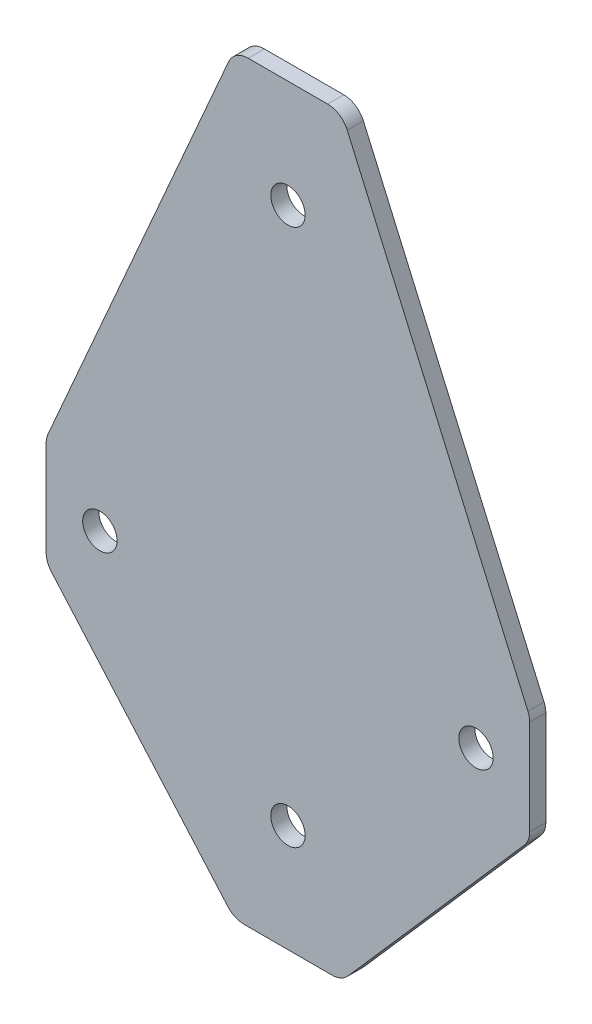
ISO-10303-21;
HEADER;
FILE_DESCRIPTION(('STEP AP214'),'2;1');
FILE_NAME('part.step','',(''),(''),'','','');
FILE_SCHEMA(('AUTOMOTIVE_DESIGN { 1 0 10303 214 1 1 1 1 }'));
ENDSEC;
DATA;
#1=APPLICATION_CONTEXT('core data for automotive mechanical design processes');
#2=APPLICATION_PROTOCOL_DEFINITION('international standard','automotive_design',2000,#1);
#3=PRODUCT_CONTEXT('',#1,'mechanical');
#4=PRODUCT('Part','Part','',(#3));
#5=PRODUCT_RELATED_PRODUCT_CATEGORY('part','',(#4));
#6=PRODUCT_DEFINITION_FORMATION('','',#4);
#7=PRODUCT_DEFINITION_CONTEXT('part definition',#1,'design');
#8=PRODUCT_DEFINITION('design','',#6,#7);
#9=PRODUCT_DEFINITION_SHAPE('','',#8);
#10=(LENGTH_UNIT() NAMED_UNIT(*) SI_UNIT(.MILLI.,.METRE.));
#11=(NAMED_UNIT(*) PLANE_ANGLE_UNIT() SI_UNIT($,.RADIAN.));
#12=(NAMED_UNIT(*) SI_UNIT($,.STERADIAN.) SOLID_ANGLE_UNIT());
#13=UNCERTAINTY_MEASURE_WITH_UNIT(LENGTH_MEASURE(1.E-05),#10,'distance_accuracy_value','');
#14=(GEOMETRIC_REPRESENTATION_CONTEXT(3) GLOBAL_UNCERTAINTY_ASSIGNED_CONTEXT((#13)) GLOBAL_UNIT_ASSIGNED_CONTEXT((#10,
#11,#12)) REPRESENTATION_CONTEXT('',''));
#15=CARTESIAN_POINT('',(0.,0.,0.));
#16=DIRECTION('',(0.,0.,1.));
#17=DIRECTION('',(1.,0.,0.));
#18=AXIS2_PLACEMENT_3D('',#15,#16,#17);
#19=CARTESIAN_POINT('',(26.2295081967213,11.4754098360656,1.5));
#20=DIRECTION('',(0.916157334902189,0.400818834019708,0.));
#21=DIRECTION('',(-0.400818834019708,0.916157334902189,0.));
#22=AXIS2_PLACEMENT_3D('',#19,#20,#21);
#23=PLANE('',#22);
#24=DIRECTION('',(0.400818834019708,-0.916157334902189,0.));
#25=VECTOR('',#24,1.);
#26=CARTESIAN_POINT('',(26.2295081967213,11.4754098360656,1.5));
#27=LINE('',#26,#25);
#28=CARTESIAN_POINT('',(5.52428352023275,58.8016376680394,1.5));
#29=VERTEX_POINT('',#28);
#30=CARTESIAN_POINT('',(22.3323146698044,20.3832807547329,1.5));
#31=VERTEX_POINT('',#30);
#32=EDGE_CURVE('E210',#29,#31,#27,.T.);
#33=ORIENTED_EDGE('',*,*,#32,.T.);
#34=DIRECTION('',(0.,0.,-1.));
#35=VECTOR('',#34,1.);
#36=CARTESIAN_POINT('',(22.3323146698044,20.3832807547329,1.5));
#37=LINE('',#36,#35);
#38=CARTESIAN_POINT('',(22.3323146698044,20.3832807547329,0.));
#39=VERTEX_POINT('',#38);
#40=EDGE_CURVE('E286',#31,#39,#37,.T.);
#41=ORIENTED_EDGE('',*,*,#40,.T.);
#42=DIRECTION('',(0.400818834019708,-0.916157334902189,0.));
#43=VECTOR('',#42,1.);
#44=CARTESIAN_POINT('',(26.2295081967213,11.4754098360656,0.));
#45=LINE('',#44,#43);
#46=CARTESIAN_POINT('',(5.52428352023275,58.8016376680394,0.));
#47=VERTEX_POINT('',#46);
#48=EDGE_CURVE('E300',#47,#39,#45,.T.);
#49=ORIENTED_EDGE('',*,*,#48,.F.);
#50=DIRECTION('',(0.,0.,-1.));
#51=VECTOR('',#50,1.);
#52=CARTESIAN_POINT('',(5.52428352023275,58.8016376680394,1.5));
#53=LINE('',#52,#51);
#54=EDGE_CURVE('E284',#47,#29,#53,.F.);
#55=ORIENTED_EDGE('',*,*,#54,.T.);
#56=EDGE_LOOP('',(#33,#41,#49,#55));
#57=FACE_BOUND('',#56,.T.);
#58=ADVANCED_FACE('F39',(#57),#23,.T.);
#59=CARTESIAN_POINT('',(0.,60.,1.5));
#60=DIRECTION('',(0.,1.,0.));
#61=DIRECTION('',(0.,0.,1.));
#62=AXIS2_PLACEMENT_3D('',#59,#60,#61);
#63=PLANE('',#62);
#64=DIRECTION('',(1.,0.,0.));
#65=VECTOR('',#64,1.);
#66=CARTESIAN_POINT('',(0.,60.,0.));
#67=LINE('',#66,#65);
#68=CARTESIAN_POINT('',(-3.69196885042837,60.,0.));
#69=VERTEX_POINT('',#68);
#70=CARTESIAN_POINT('',(3.69196885042837,60.,0.));
#71=VERTEX_POINT('',#70);
#72=EDGE_CURVE('E186',#69,#71,#67,.T.);
#73=ORIENTED_EDGE('',*,*,#72,.F.);
#74=DIRECTION('',(0.,0.,-1.));
#75=VECTOR('',#74,1.);
#76=CARTESIAN_POINT('',(-3.69196885042837,60.,1.5));
#77=LINE('',#76,#75);
#78=CARTESIAN_POINT('',(-3.69196885042837,60.,1.5));
#79=VERTEX_POINT('',#78);
#80=EDGE_CURVE('E12',#69,#79,#77,.F.);
#81=ORIENTED_EDGE('',*,*,#80,.T.);
#82=DIRECTION('',(1.,0.,0.));
#83=VECTOR('',#82,1.);
#84=CARTESIAN_POINT('',(0.,60.,1.5));
#85=LINE('',#84,#83);
#86=CARTESIAN_POINT('',(3.69196885042837,60.,1.5));
#87=VERTEX_POINT('',#86);
#88=EDGE_CURVE('E242',#79,#87,#85,.T.);
#89=ORIENTED_EDGE('',*,*,#88,.T.);
#90=DIRECTION('',(0.,0.,-1.));
#91=VECTOR('',#90,1.);
#92=CARTESIAN_POINT('',(3.69196885042837,60.,1.5));
#93=LINE('',#92,#91);
#94=EDGE_CURVE('E47',#87,#71,#93,.T.);
#95=ORIENTED_EDGE('',*,*,#94,.T.);
#96=EDGE_LOOP('',(#73,#81,#89,#95));
#97=FACE_BOUND('',#96,.T.);
#98=ADVANCED_FACE('F293',(#97),#63,.T.);
#99=CARTESIAN_POINT('',(-26.2295081967213,11.4754098360656,1.5));
#100=DIRECTION('',(0.916157334902189,-0.400818834019708,0.));
#101=DIRECTION('',(0.400818834019708,0.916157334902189,0.));
#102=AXIS2_PLACEMENT_3D('',#99,#100,#101);
#103=PLANE('',#102);
#104=DIRECTION('',(-0.400818834019708,-0.916157334902189,0.));
#105=VECTOR('',#104,1.);
#106=CARTESIAN_POINT('',(-26.2295081967213,11.4754098360656,0.));
#107=LINE('',#106,#105);
#108=CARTESIAN_POINT('',(-5.52428352023275,58.8016376680394,0.));
#109=VERTEX_POINT('',#108);
#110=CARTESIAN_POINT('',(-22.3323146698044,20.3832807547328,0.));
#111=VERTEX_POINT('',#110);
#112=EDGE_CURVE('E181',#109,#111,#107,.T.);
#113=ORIENTED_EDGE('',*,*,#112,.T.);
#114=DIRECTION('',(0.,0.,-1.));
#115=VECTOR('',#114,1.);
#116=CARTESIAN_POINT('',(-22.3323146698044,20.3832807547328,1.5));
#117=LINE('',#116,#115);
#118=CARTESIAN_POINT('',(-22.3323146698044,20.3832807547328,1.5));
#119=VERTEX_POINT('',#118);
#120=EDGE_CURVE('E158',#111,#119,#117,.F.);
#121=ORIENTED_EDGE('',*,*,#120,.T.);
#122=DIRECTION('',(-0.400818834019708,-0.916157334902189,0.));
#123=VECTOR('',#122,1.);
#124=CARTESIAN_POINT('',(-26.2295081967213,11.4754098360656,1.5));
#125=LINE('',#124,#123);
#126=CARTESIAN_POINT('',(-5.52428352023275,58.8016376680394,1.5));
#127=VERTEX_POINT('',#126);
#128=EDGE_CURVE('E246',#127,#119,#125,.T.);
#129=ORIENTED_EDGE('',*,*,#128,.F.);
#130=DIRECTION('',(0.,0.,-1.));
#131=VECTOR('',#130,1.);
#132=CARTESIAN_POINT('',(-5.52428352023275,58.8016376680394,0.));
#133=LINE('',#132,#131);
#134=EDGE_CURVE('E163',#127,#109,#133,.T.);
#135=ORIENTED_EDGE('',*,*,#134,.T.);
#136=EDGE_LOOP('',(#113,#121,#129,#135));
#137=FACE_BOUND('',#136,.T.);
#138=ADVANCED_FACE('F372',(#137),#103,.F.);
#139=CARTESIAN_POINT('',(-22.5,0.,1.5));
#140=DIRECTION('',(1.,0.,0.));
#141=DIRECTION('',(0.,0.,-1.));
#142=AXIS2_PLACEMENT_3D('',#139,#140,#141);
#143=PLANE('',#142);
#144=DIRECTION('',(0.,-1.,0.));
#145=VECTOR('',#144,1.);
#146=CARTESIAN_POINT('',(-22.5,0.,1.5));
#147=LINE('',#146,#145);
#148=CARTESIAN_POINT('',(-22.5,19.5816430866934,1.5));
#149=VERTEX_POINT('',#148);
#150=CARTESIAN_POINT('',(-22.5,10.7514702322099,1.5));
#151=VERTEX_POINT('',#150);
#152=EDGE_CURVE('E173',#149,#151,#147,.T.);
#153=ORIENTED_EDGE('',*,*,#152,.F.);
#154=DIRECTION('',(0.,0.,-1.));
#155=VECTOR('',#154,1.);
#156=CARTESIAN_POINT('',(-22.5,19.5816430866934,1.5));
#157=LINE('',#156,#155);
#158=CARTESIAN_POINT('',(-22.5,19.5816430866934,0.));
#159=VERTEX_POINT('',#158);
#160=EDGE_CURVE('E157',#149,#159,#157,.T.);
#161=ORIENTED_EDGE('',*,*,#160,.T.);
#162=DIRECTION('',(0.,-1.,0.));
#163=VECTOR('',#162,1.);
#164=CARTESIAN_POINT('',(-22.5,0.,0.));
#165=LINE('',#164,#163);
#166=CARTESIAN_POINT('',(-22.5,10.7514702322099,0.));
#167=VERTEX_POINT('',#166);
#168=EDGE_CURVE('E170',#159,#167,#165,.T.);
#169=ORIENTED_EDGE('',*,*,#168,.T.);
#170=DIRECTION('',(0.,0.,-1.));
#171=VECTOR('',#170,1.);
#172=CARTESIAN_POINT('',(-22.5,10.7514702322099,1.5));
#173=LINE('',#172,#171);
#174=EDGE_CURVE('E175',#167,#151,#173,.F.);
#175=ORIENTED_EDGE('',*,*,#174,.T.);
#176=EDGE_LOOP('',(#153,#161,#169,#175));
#177=FACE_BOUND('',#176,.T.);
#178=ADVANCED_FACE('F169',(#177),#143,.F.);
#179=CARTESIAN_POINT('',(-7.78761061946905,-6.8141592920354,1.5));
#180=DIRECTION('',(0.752576694706878,0.658504607868517,0.));
#181=DIRECTION('',(-0.658504607868517,0.752576694706879,0.));
#182=AXIS2_PLACEMENT_3D('',#179,#180,#181);
#183=PLANE('',#182);
#184=DIRECTION('',(0.658504607868517,-0.752576694706878,0.));
#185=VECTOR('',#184,1.);
#186=CARTESIAN_POINT('',(-7.78761061946905,-6.8141592920354,1.5));
#187=LINE('',#186,#185);
#188=CARTESIAN_POINT('',(-22.0051533894138,9.43446101647287,1.5));
#189=VERTEX_POINT('',#188);
#190=CARTESIAN_POINT('',(-5.59761693623009,-9.31700921573707,1.5));
#191=VERTEX_POINT('',#190);
#192=EDGE_CURVE('E341',#189,#191,#187,.T.);
#193=ORIENTED_EDGE('',*,*,#192,.F.);
#194=DIRECTION('',(0.,0.,-1.));
#195=VECTOR('',#194,1.);
#196=CARTESIAN_POINT('',(-22.0051533894138,9.43446101647287,1.5));
#197=LINE('',#196,#195);
#198=CARTESIAN_POINT('',(-22.0051533894138,9.43446101647287,0.));
#199=VERTEX_POINT('',#198);
#200=EDGE_CURVE('E267',#189,#199,#197,.T.);
#201=ORIENTED_EDGE('',*,*,#200,.T.);
#202=DIRECTION('',(0.658504607868517,-0.752576694706878,0.));
#203=VECTOR('',#202,1.);
#204=CARTESIAN_POINT('',(-7.78761061946905,-6.8141592920354,0.));
#205=LINE('',#204,#203);
#206=CARTESIAN_POINT('',(-5.59761693623009,-9.31700921573707,0.));
#207=VERTEX_POINT('',#206);
#208=EDGE_CURVE('E180',#199,#207,#205,.T.);
#209=ORIENTED_EDGE('',*,*,#208,.T.);
#210=DIRECTION('',(0.,0.,-1.));
#211=VECTOR('',#210,1.);
#212=CARTESIAN_POINT('',(-5.59761693623009,-9.31700921573707,1.5));
#213=LINE('',#212,#211);
#214=EDGE_CURVE('E262',#207,#191,#213,.F.);
#215=ORIENTED_EDGE('',*,*,#214,.T.);
#216=EDGE_LOOP('',(#193,#201,#209,#215));
#217=FACE_BOUND('',#216,.T.);
#218=ADVANCED_FACE('F363',(#217),#183,.F.);
#219=CARTESIAN_POINT('',(0.,-10.,1.5));
#220=DIRECTION('',(0.,1.,0.));
#221=DIRECTION('',(-1.,0.,0.));
#222=AXIS2_PLACEMENT_3D('',#219,#220,#221);
#223=PLANE('',#222);
#224=DIRECTION('',(1.,0.,0.));
#225=VECTOR('',#224,1.);
#226=CARTESIAN_POINT('',(0.,-10.,1.5));
#227=LINE('',#226,#225);
#228=CARTESIAN_POINT('',(-4.09246354681634,-10.,1.5));
#229=VERTEX_POINT('',#228);
#230=CARTESIAN_POINT('',(4.09246354681633,-10.,1.5));
#231=VERTEX_POINT('',#230);
#232=EDGE_CURVE('E338',#229,#231,#227,.T.);
#233=ORIENTED_EDGE('',*,*,#232,.F.);
#234=DIRECTION('',(0.,0.,-1.));
#235=VECTOR('',#234,1.);
#236=CARTESIAN_POINT('',(-4.09246354681634,-10.,1.5));
#237=LINE('',#236,#235);
#238=CARTESIAN_POINT('',(-4.09246354681634,-10.,0.));
#239=VERTEX_POINT('',#238);
#240=EDGE_CURVE('E272',#229,#239,#237,.T.);
#241=ORIENTED_EDGE('',*,*,#240,.T.);
#242=DIRECTION('',(1.,0.,0.));
#243=VECTOR('',#242,1.);
#244=CARTESIAN_POINT('',(0.,-10.,0.));
#245=LINE('',#244,#243);
#246=CARTESIAN_POINT('',(4.09246354681633,-10.,0.));
#247=VERTEX_POINT('',#246);
#248=EDGE_CURVE('E184',#239,#247,#245,.T.);
#249=ORIENTED_EDGE('',*,*,#248,.T.);
#250=DIRECTION('',(0.,0.,-1.));
#251=VECTOR('',#250,1.);
#252=CARTESIAN_POINT('',(4.09246354681633,-10.,1.5));
#253=LINE('',#252,#251);
#254=EDGE_CURVE('E270',#247,#231,#253,.F.);
#255=ORIENTED_EDGE('',*,*,#254,.T.);
#256=EDGE_LOOP('',(#233,#241,#249,#255));
#257=FACE_BOUND('',#256,.T.);
#258=ADVANCED_FACE('F358',(#257),#223,.F.);
#259=CARTESIAN_POINT('',(7.78761061946905,-6.8141592920354,1.5));
#260=DIRECTION('',(0.752576694706878,-0.658504607868517,0.));
#261=DIRECTION('',(0.658504607868517,0.752576694706878,0.));
#262=AXIS2_PLACEMENT_3D('',#259,#260,#261);
#263=PLANE('',#262);
#264=DIRECTION('',(-0.658504607868518,-0.752576694706878,0.));
#265=VECTOR('',#264,1.);
#266=CARTESIAN_POINT('',(7.78761061946905,-6.8141592920354,1.5));
#267=LINE('',#266,#265);
#268=CARTESIAN_POINT('',(22.0051533894138,9.43446101647286,1.5));
#269=VERTEX_POINT('',#268);
#270=CARTESIAN_POINT('',(5.59761693623009,-9.31700921573707,1.5));
#271=VERTEX_POINT('',#270);
#272=EDGE_CURVE('E319',#269,#271,#267,.T.);
#273=ORIENTED_EDGE('',*,*,#272,.T.);
#274=DIRECTION('',(0.,0.,-1.));
#275=VECTOR('',#274,1.);
#276=CARTESIAN_POINT('',(5.59761693623009,-9.31700921573707,0.));
#277=LINE('',#276,#275);
#278=CARTESIAN_POINT('',(5.59761693623009,-9.31700921573707,0.));
#279=VERTEX_POINT('',#278);
#280=EDGE_CURVE('E277',#271,#279,#277,.T.);
#281=ORIENTED_EDGE('',*,*,#280,.T.);
#282=DIRECTION('',(-0.658504607868518,-0.752576694706878,0.));
#283=VECTOR('',#282,1.);
#284=CARTESIAN_POINT('',(7.78761061946905,-6.8141592920354,0.));
#285=LINE('',#284,#283);
#286=CARTESIAN_POINT('',(22.0051533894138,9.43446101647286,0.));
#287=VERTEX_POINT('',#286);
#288=EDGE_CURVE('E192',#287,#279,#285,.T.);
#289=ORIENTED_EDGE('',*,*,#288,.F.);
#290=DIRECTION('',(0.,0.,-1.));
#291=VECTOR('',#290,1.);
#292=CARTESIAN_POINT('',(22.0051533894138,9.43446101647286,1.5));
#293=LINE('',#292,#291);
#294=EDGE_CURVE('E275',#287,#269,#293,.F.);
#295=ORIENTED_EDGE('',*,*,#294,.T.);
#296=EDGE_LOOP('',(#273,#281,#289,#295));
#297=FACE_BOUND('',#296,.T.);
#298=ADVANCED_FACE('F370',(#297),#263,.T.);
#299=CARTESIAN_POINT('',(-17.5,15.,1.5));
#300=DIRECTION('',(0.,0.,-1.));
#301=DIRECTION('',(-1.,0.,0.));
#302=AXIS2_PLACEMENT_3D('',#299,#300,#301);
#303=CYLINDRICAL_SURFACE('',#302,1.6);
#304=CARTESIAN_POINT('',(-17.5,15.,1.5));
#305=DIRECTION('',(0.,0.,1.));
#306=DIRECTION('',(1.,0.,0.));
#307=AXIS2_PLACEMENT_3D('',#304,#305,#306);
#308=CIRCLE('',#307,1.6);
#309=CARTESIAN_POINT('',(-15.9,15.,1.5));
#310=VERTEX_POINT('',#309);
#311=EDGE_CURVE('E304',#310,#310,#308,.T.);
#312=ORIENTED_EDGE('',*,*,#311,.T.);
#313=EDGE_LOOP('',(#312));
#314=FACE_BOUND('',#313,.T.);
#315=CARTESIAN_POINT('',(-17.5,15.,0.));
#316=DIRECTION('',(0.,0.,1.));
#317=DIRECTION('',(1.,0.,0.));
#318=AXIS2_PLACEMENT_3D('',#315,#316,#317);
#319=CIRCLE('',#318,1.6);
#320=CARTESIAN_POINT('',(-15.9,15.,0.));
#321=VERTEX_POINT('',#320);
#322=EDGE_CURVE('E204',#321,#321,#319,.T.);
#323=ORIENTED_EDGE('',*,*,#322,.F.);
#324=EDGE_LOOP('',(#323));
#325=FACE_BOUND('',#324,.T.);
#326=ADVANCED_FACE('F439',(#314,#325),#303,.F.);
#327=CARTESIAN_POINT('',(0.,50.,1.5));
#328=DIRECTION('',(0.,0.,-1.));
#329=DIRECTION('',(-1.,0.,0.));
#330=AXIS2_PLACEMENT_3D('',#327,#328,#329);
#331=CYLINDRICAL_SURFACE('',#330,1.6);
#332=CARTESIAN_POINT('',(0.,50.,1.5));
#333=DIRECTION('',(0.,0.,1.));
#334=DIRECTION('',(1.,0.,0.));
#335=AXIS2_PLACEMENT_3D('',#332,#333,#334);
#336=CIRCLE('',#335,1.6);
#337=CARTESIAN_POINT('',(1.6,50.,1.5));
#338=VERTEX_POINT('',#337);
#339=EDGE_CURVE('E308',#338,#338,#336,.T.);
#340=ORIENTED_EDGE('',*,*,#339,.T.);
#341=EDGE_LOOP('',(#340));
#342=FACE_BOUND('',#341,.T.);
#343=CARTESIAN_POINT('',(0.,50.,0.));
#344=DIRECTION('',(0.,0.,1.));
#345=DIRECTION('',(1.,0.,0.));
#346=AXIS2_PLACEMENT_3D('',#343,#344,#345);
#347=CIRCLE('',#346,1.6);
#348=CARTESIAN_POINT('',(1.6,50.,0.));
#349=VERTEX_POINT('',#348);
#350=EDGE_CURVE('E201',#349,#349,#347,.T.);
#351=ORIENTED_EDGE('',*,*,#350,.F.);
#352=EDGE_LOOP('',(#351));
#353=FACE_BOUND('',#352,.T.);
#354=ADVANCED_FACE('F534',(#342,#353),#331,.F.);
#355=CARTESIAN_POINT('',(0.,0.,1.5));
#356=DIRECTION('',(0.,0.,-1.));
#357=DIRECTION('',(-1.,0.,0.));
#358=AXIS2_PLACEMENT_3D('',#355,#356,#357);
#359=CYLINDRICAL_SURFACE('',#358,1.6);
#360=CARTESIAN_POINT('',(0.,0.,1.5));
#361=DIRECTION('',(0.,0.,1.));
#362=DIRECTION('',(1.,0.,0.));
#363=AXIS2_PLACEMENT_3D('',#360,#361,#362);
#364=CIRCLE('',#363,1.6);
#365=CARTESIAN_POINT('',(1.6,0.,1.5));
#366=VERTEX_POINT('',#365);
#367=EDGE_CURVE('E312',#366,#366,#364,.T.);
#368=ORIENTED_EDGE('',*,*,#367,.T.);
#369=EDGE_LOOP('',(#368));
#370=FACE_BOUND('',#369,.T.);
#371=CARTESIAN_POINT('',(0.,0.,0.));
#372=DIRECTION('',(0.,0.,1.));
#373=DIRECTION('',(1.,0.,0.));
#374=AXIS2_PLACEMENT_3D('',#371,#372,#373);
#375=CIRCLE('',#374,1.6);
#376=CARTESIAN_POINT('',(1.6,0.,0.));
#377=VERTEX_POINT('',#376);
#378=EDGE_CURVE('E198',#377,#377,#375,.T.);
#379=ORIENTED_EDGE('',*,*,#378,.F.);
#380=EDGE_LOOP('',(#379));
#381=FACE_BOUND('',#380,.T.);
#382=ADVANCED_FACE('F453',(#370,#381),#359,.F.);
#383=CARTESIAN_POINT('',(22.5,0.,1.5));
#384=DIRECTION('',(1.,0.,0.));
#385=DIRECTION('',(0.,0.,-1.));
#386=AXIS2_PLACEMENT_3D('',#383,#384,#385);
#387=PLANE('',#386);
#388=DIRECTION('',(0.,-1.,0.));
#389=VECTOR('',#388,1.);
#390=CARTESIAN_POINT('',(22.5,0.,1.5));
#391=LINE('',#390,#389);
#392=CARTESIAN_POINT('',(22.5,19.5816430866934,1.5));
#393=VERTEX_POINT('',#392);
#394=CARTESIAN_POINT('',(22.5,10.7514702322099,1.5));
#395=VERTEX_POINT('',#394);
#396=EDGE_CURVE('E316',#393,#395,#391,.T.);
#397=ORIENTED_EDGE('',*,*,#396,.T.);
#398=DIRECTION('',(0.,0.,-1.));
#399=VECTOR('',#398,1.);
#400=CARTESIAN_POINT('',(22.5,10.7514702322099,1.5));
#401=LINE('',#400,#399);
#402=CARTESIAN_POINT('',(22.5,10.7514702322099,0.));
#403=VERTEX_POINT('',#402);
#404=EDGE_CURVE('E281',#395,#403,#401,.T.);
#405=ORIENTED_EDGE('',*,*,#404,.T.);
#406=DIRECTION('',(0.,-1.,0.));
#407=VECTOR('',#406,1.);
#408=CARTESIAN_POINT('',(22.5,0.,0.));
#409=LINE('',#408,#407);
#410=CARTESIAN_POINT('',(22.5,19.5816430866934,0.));
#411=VERTEX_POINT('',#410);
#412=EDGE_CURVE('E195',#411,#403,#409,.T.);
#413=ORIENTED_EDGE('',*,*,#412,.F.);
#414=DIRECTION('',(0.,0.,-1.));
#415=VECTOR('',#414,1.);
#416=CARTESIAN_POINT('',(22.5,19.5816430866934,1.5));
#417=LINE('',#416,#415);
#418=EDGE_CURVE('E61',#411,#393,#417,.F.);
#419=ORIENTED_EDGE('',*,*,#418,.T.);
#420=EDGE_LOOP('',(#397,#405,#413,#419));
#421=FACE_BOUND('',#420,.T.);
#422=ADVANCED_FACE('F447',(#421),#387,.T.);
#423=CARTESIAN_POINT('',(17.5,15.,1.5));
#424=DIRECTION('',(0.,0.,-1.));
#425=DIRECTION('',(-1.,0.,0.));
#426=AXIS2_PLACEMENT_3D('',#423,#424,#425);
#427=CYLINDRICAL_SURFACE('',#426,1.6);
#428=CARTESIAN_POINT('',(17.5,15.,1.5));
#429=DIRECTION('',(0.,0.,1.));
#430=DIRECTION('',(1.,0.,0.));
#431=AXIS2_PLACEMENT_3D('',#428,#429,#430);
#432=CIRCLE('',#431,1.6);
#433=CARTESIAN_POINT('',(19.1,15.,1.5));
#434=VERTEX_POINT('',#433);
#435=EDGE_CURVE('E211',#434,#434,#432,.F.);
#436=ORIENTED_EDGE('',*,*,#435,.F.);
#437=EDGE_LOOP('',(#436));
#438=FACE_BOUND('',#437,.T.);
#439=CARTESIAN_POINT('',(17.5,15.,0.));
#440=DIRECTION('',(0.,0.,1.));
#441=DIRECTION('',(1.,0.,0.));
#442=AXIS2_PLACEMENT_3D('',#439,#440,#441);
#443=CIRCLE('',#442,1.6);
#444=CARTESIAN_POINT('',(19.1,15.,0.));
#445=VERTEX_POINT('',#444);
#446=EDGE_CURVE('E207',#445,#445,#443,.F.);
#447=ORIENTED_EDGE('',*,*,#446,.T.);
#448=EDGE_LOOP('',(#447));
#449=FACE_BOUND('',#448,.T.);
#450=ADVANCED_FACE('F452',(#438,#449),#427,.F.);
#451=CARTESIAN_POINT('',(0.,0.,1.5));
#452=DIRECTION('',(0.,0.,1.));
#453=DIRECTION('',(1.,0.,0.));
#454=AXIS2_PLACEMENT_3D('',#451,#452,#453);
#455=PLANE('',#454);
#456=ORIENTED_EDGE('',*,*,#128,.T.);
#457=CARTESIAN_POINT('',(-20.5,19.5816430866934,1.5));
#458=DIRECTION('',(0.,0.,1.));
#459=DIRECTION('',(1.,0.,0.));
#460=AXIS2_PLACEMENT_3D('',#457,#458,#459);
#461=CIRCLE('',#460,2.);
#462=EDGE_CURVE('E258',#119,#149,#461,.T.);
#463=ORIENTED_EDGE('',*,*,#462,.T.);
#464=ORIENTED_EDGE('',*,*,#152,.T.);
#465=CARTESIAN_POINT('',(-20.5,10.7514702322099,1.5));
#466=DIRECTION('',(0.,0.,1.));
#467=DIRECTION('',(1.,0.,0.));
#468=AXIS2_PLACEMENT_3D('',#465,#466,#467);
#469=CIRCLE('',#468,2.);
#470=EDGE_CURVE('E263',#151,#189,#469,.T.);
#471=ORIENTED_EDGE('',*,*,#470,.T.);
#472=ORIENTED_EDGE('',*,*,#192,.T.);
#473=CARTESIAN_POINT('',(-4.09246354681634,-8.00000000000003,1.5));
#474=DIRECTION('',(0.,0.,1.));
#475=DIRECTION('',(1.,0.,0.));
#476=AXIS2_PLACEMENT_3D('',#473,#474,#475);
#477=CIRCLE('',#476,2.);
#478=EDGE_CURVE('E332',#191,#229,#477,.T.);
#479=ORIENTED_EDGE('',*,*,#478,.T.);
#480=ORIENTED_EDGE('',*,*,#232,.T.);
#481=CARTESIAN_POINT('',(4.09246354681634,-8.00000000000004,1.5));
#482=DIRECTION('',(0.,0.,1.));
#483=DIRECTION('',(1.,0.,0.));
#484=AXIS2_PLACEMENT_3D('',#481,#482,#483);
#485=CIRCLE('',#484,2.);
#486=EDGE_CURVE('E330',#231,#271,#485,.T.);
#487=ORIENTED_EDGE('',*,*,#486,.T.);
#488=ORIENTED_EDGE('',*,*,#272,.F.);
#489=CARTESIAN_POINT('',(20.5,10.7514702322099,1.5));
#490=DIRECTION('',(0.,0.,1.));
#491=DIRECTION('',(1.,0.,0.));
#492=AXIS2_PLACEMENT_3D('',#489,#490,#491);
#493=CIRCLE('',#492,2.);
#494=EDGE_CURVE('E54',#269,#395,#493,.T.);
#495=ORIENTED_EDGE('',*,*,#494,.T.);
#496=ORIENTED_EDGE('',*,*,#396,.F.);
#497=CARTESIAN_POINT('',(20.5,19.5816430866934,1.5));
#498=DIRECTION('',(0.,0.,1.));
#499=DIRECTION('',(1.,0.,0.));
#500=AXIS2_PLACEMENT_3D('',#497,#498,#499);
#501=CIRCLE('',#500,2.);
#502=EDGE_CURVE('E326',#393,#31,#501,.T.);
#503=ORIENTED_EDGE('',*,*,#502,.T.);
#504=ORIENTED_EDGE('',*,*,#32,.F.);
#505=CARTESIAN_POINT('',(3.69196885042837,58.,1.5));
#506=DIRECTION('',(0.,0.,1.));
#507=DIRECTION('',(1.,0.,0.));
#508=AXIS2_PLACEMENT_3D('',#505,#506,#507);
#509=CIRCLE('',#508,2.);
#510=EDGE_CURVE('E228',#29,#87,#509,.T.);
#511=ORIENTED_EDGE('',*,*,#510,.T.);
#512=ORIENTED_EDGE('',*,*,#88,.F.);
#513=CARTESIAN_POINT('',(-3.69196885042837,58.,1.5));
#514=DIRECTION('',(0.,0.,1.));
#515=DIRECTION('',(1.,0.,0.));
#516=AXIS2_PLACEMENT_3D('',#513,#514,#515);
#517=CIRCLE('',#516,2.);
#518=EDGE_CURVE('E231',#79,#127,#517,.T.);
#519=ORIENTED_EDGE('',*,*,#518,.T.);
#520=EDGE_LOOP('',(#456,#463,#464,#471,#472,#479,#480,#487,#488,#495,#496,#503,#504,#511,#512,#519));
#521=FACE_BOUND('',#520,.T.);
#522=ORIENTED_EDGE('',*,*,#367,.F.);
#523=EDGE_LOOP('',(#522));
#524=FACE_BOUND('',#523,.T.);
#525=ORIENTED_EDGE('',*,*,#339,.F.);
#526=EDGE_LOOP('',(#525));
#527=FACE_BOUND('',#526,.T.);
#528=ORIENTED_EDGE('',*,*,#311,.F.);
#529=EDGE_LOOP('',(#528));
#530=FACE_BOUND('',#529,.T.);
#531=ORIENTED_EDGE('',*,*,#435,.T.);
#532=EDGE_LOOP('',(#531));
#533=FACE_BOUND('',#532,.T.);
#534=ADVANCED_FACE('F347',(#521,#524,#527,#530,#533),#455,.T.);
#535=CARTESIAN_POINT('',(0.,0.,0.));
#536=DIRECTION('',(0.,0.,1.));
#537=DIRECTION('',(1.,0.,0.));
#538=AXIS2_PLACEMENT_3D('',#535,#536,#537);
#539=PLANE('',#538);
#540=ORIENTED_EDGE('',*,*,#168,.F.);
#541=CARTESIAN_POINT('',(-20.5,19.5816430866934,0.));
#542=DIRECTION('',(0.,0.,1.));
#543=DIRECTION('',(1.,0.,0.));
#544=AXIS2_PLACEMENT_3D('',#541,#542,#543);
#545=CIRCLE('',#544,2.);
#546=EDGE_CURVE('E153',#159,#111,#545,.F.);
#547=ORIENTED_EDGE('',*,*,#546,.T.);
#548=ORIENTED_EDGE('',*,*,#112,.F.);
#549=CARTESIAN_POINT('',(-3.69196885042837,58.,0.));
#550=DIRECTION('',(0.,0.,1.));
#551=DIRECTION('',(1.,0.,0.));
#552=AXIS2_PLACEMENT_3D('',#549,#550,#551);
#553=CIRCLE('',#552,2.);
#554=EDGE_CURVE('E214',#109,#69,#553,.F.);
#555=ORIENTED_EDGE('',*,*,#554,.T.);
#556=ORIENTED_EDGE('',*,*,#72,.T.);
#557=CARTESIAN_POINT('',(3.69196885042837,58.,0.));
#558=DIRECTION('',(0.,0.,1.));
#559=DIRECTION('',(1.,0.,0.));
#560=AXIS2_PLACEMENT_3D('',#557,#558,#559);
#561=CIRCLE('',#560,2.);
#562=EDGE_CURVE('E174',#71,#47,#561,.F.);
#563=ORIENTED_EDGE('',*,*,#562,.T.);
#564=ORIENTED_EDGE('',*,*,#48,.T.);
#565=CARTESIAN_POINT('',(20.5,19.5816430866934,0.));
#566=DIRECTION('',(0.,0.,1.));
#567=DIRECTION('',(1.,0.,0.));
#568=AXIS2_PLACEMENT_3D('',#565,#566,#567);
#569=CIRCLE('',#568,2.);
#570=EDGE_CURVE('E216',#39,#411,#569,.F.);
#571=ORIENTED_EDGE('',*,*,#570,.T.);
#572=ORIENTED_EDGE('',*,*,#412,.T.);
#573=CARTESIAN_POINT('',(20.5,10.7514702322099,0.));
#574=DIRECTION('',(0.,0.,1.));
#575=DIRECTION('',(1.,0.,0.));
#576=AXIS2_PLACEMENT_3D('',#573,#574,#575);
#577=CIRCLE('',#576,2.);
#578=EDGE_CURVE('E218',#403,#287,#577,.F.);
#579=ORIENTED_EDGE('',*,*,#578,.T.);
#580=ORIENTED_EDGE('',*,*,#288,.T.);
#581=CARTESIAN_POINT('',(4.09246354681634,-8.00000000000004,0.));
#582=DIRECTION('',(0.,0.,1.));
#583=DIRECTION('',(1.,0.,0.));
#584=AXIS2_PLACEMENT_3D('',#581,#582,#583);
#585=CIRCLE('',#584,2.);
#586=EDGE_CURVE('E220',#279,#247,#585,.F.);
#587=ORIENTED_EDGE('',*,*,#586,.T.);
#588=ORIENTED_EDGE('',*,*,#248,.F.);
#589=CARTESIAN_POINT('',(-4.09246354681634,-8.00000000000003,0.));
#590=DIRECTION('',(0.,0.,1.));
#591=DIRECTION('',(1.,0.,0.));
#592=AXIS2_PLACEMENT_3D('',#589,#590,#591);
#593=CIRCLE('',#592,2.);
#594=EDGE_CURVE('E222',#239,#207,#593,.F.);
#595=ORIENTED_EDGE('',*,*,#594,.T.);
#596=ORIENTED_EDGE('',*,*,#208,.F.);
#597=CARTESIAN_POINT('',(-20.5,10.7514702322099,0.));
#598=DIRECTION('',(0.,0.,1.));
#599=DIRECTION('',(1.,0.,0.));
#600=AXIS2_PLACEMENT_3D('',#597,#598,#599);
#601=CIRCLE('',#600,2.);
#602=EDGE_CURVE('E164',#199,#167,#601,.F.);
#603=ORIENTED_EDGE('',*,*,#602,.T.);
#604=EDGE_LOOP('',(#540,#547,#548,#555,#556,#563,#564,#571,#572,#579,#580,#587,#588,#595,#596,#603));
#605=FACE_BOUND('',#604,.T.);
#606=ORIENTED_EDGE('',*,*,#378,.T.);
#607=EDGE_LOOP('',(#606));
#608=FACE_BOUND('',#607,.T.);
#609=ORIENTED_EDGE('',*,*,#350,.T.);
#610=EDGE_LOOP('',(#609));
#611=FACE_BOUND('',#610,.T.);
#612=ORIENTED_EDGE('',*,*,#322,.T.);
#613=EDGE_LOOP('',(#612));
#614=FACE_BOUND('',#613,.T.);
#615=ORIENTED_EDGE('',*,*,#446,.F.);
#616=EDGE_LOOP('',(#615));
#617=FACE_BOUND('',#616,.T.);
#618=ADVANCED_FACE('F177',(#605,#608,#611,#614,#617),#539,.F.);
#619=CARTESIAN_POINT('',(-20.5,19.5816430866934,1.5));
#620=DIRECTION('',(0.,0.,-1.));
#621=DIRECTION('',(-1.,0.,0.));
#622=AXIS2_PLACEMENT_3D('',#619,#620,#621);
#623=CYLINDRICAL_SURFACE('',#622,2.);
#624=ORIENTED_EDGE('',*,*,#462,.F.);
#625=ORIENTED_EDGE('',*,*,#120,.F.);
#626=ORIENTED_EDGE('',*,*,#546,.F.);
#627=ORIENTED_EDGE('',*,*,#160,.F.);
#628=EDGE_LOOP('',(#624,#625,#626,#627));
#629=FACE_BOUND('',#628,.T.);
#630=ADVANCED_FACE('F156',(#629),#623,.T.);
#631=CARTESIAN_POINT('',(-20.5,10.7514702322099,1.5));
#632=DIRECTION('',(0.,0.,-1.));
#633=DIRECTION('',(-1.,0.,0.));
#634=AXIS2_PLACEMENT_3D('',#631,#632,#633);
#635=CYLINDRICAL_SURFACE('',#634,2.);
#636=ORIENTED_EDGE('',*,*,#470,.F.);
#637=ORIENTED_EDGE('',*,*,#174,.F.);
#638=ORIENTED_EDGE('',*,*,#602,.F.);
#639=ORIENTED_EDGE('',*,*,#200,.F.);
#640=EDGE_LOOP('',(#636,#637,#638,#639));
#641=FACE_BOUND('',#640,.T.);
#642=ADVANCED_FACE('F351',(#641),#635,.T.);
#643=CARTESIAN_POINT('',(-4.09246354681634,-8.00000000000003,1.5));
#644=DIRECTION('',(0.,0.,-1.));
#645=DIRECTION('',(-1.,0.,0.));
#646=AXIS2_PLACEMENT_3D('',#643,#644,#645);
#647=CYLINDRICAL_SURFACE('',#646,2.);
#648=ORIENTED_EDGE('',*,*,#478,.F.);
#649=ORIENTED_EDGE('',*,*,#214,.F.);
#650=ORIENTED_EDGE('',*,*,#594,.F.);
#651=ORIENTED_EDGE('',*,*,#240,.F.);
#652=EDGE_LOOP('',(#648,#649,#650,#651));
#653=FACE_BOUND('',#652,.T.);
#654=ADVANCED_FACE('F361',(#653),#647,.T.);
#655=CARTESIAN_POINT('',(4.09246354681634,-8.00000000000004,1.5));
#656=DIRECTION('',(0.,0.,1.));
#657=DIRECTION('',(1.,0.,0.));
#658=AXIS2_PLACEMENT_3D('',#655,#656,#657);
#659=CYLINDRICAL_SURFACE('',#658,2.);
#660=ORIENTED_EDGE('',*,*,#486,.F.);
#661=ORIENTED_EDGE('',*,*,#254,.F.);
#662=ORIENTED_EDGE('',*,*,#586,.F.);
#663=ORIENTED_EDGE('',*,*,#280,.F.);
#664=EDGE_LOOP('',(#660,#661,#662,#663));
#665=FACE_BOUND('',#664,.T.);
#666=ADVANCED_FACE('F390',(#665),#659,.T.);
#667=CARTESIAN_POINT('',(20.5,10.7514702322099,1.5));
#668=DIRECTION('',(0.,0.,-1.));
#669=DIRECTION('',(-1.,0.,0.));
#670=AXIS2_PLACEMENT_3D('',#667,#668,#669);
#671=CYLINDRICAL_SURFACE('',#670,2.);
#672=ORIENTED_EDGE('',*,*,#494,.F.);
#673=ORIENTED_EDGE('',*,*,#294,.F.);
#674=ORIENTED_EDGE('',*,*,#578,.F.);
#675=ORIENTED_EDGE('',*,*,#404,.F.);
#676=EDGE_LOOP('',(#672,#673,#674,#675));
#677=FACE_BOUND('',#676,.T.);
#678=ADVANCED_FACE('F393',(#677),#671,.T.);
#679=CARTESIAN_POINT('',(20.5,19.5816430866934,1.5));
#680=DIRECTION('',(0.,0.,-1.));
#681=DIRECTION('',(-1.,0.,0.));
#682=AXIS2_PLACEMENT_3D('',#679,#680,#681);
#683=CYLINDRICAL_SURFACE('',#682,2.);
#684=ORIENTED_EDGE('',*,*,#502,.F.);
#685=ORIENTED_EDGE('',*,*,#418,.F.);
#686=ORIENTED_EDGE('',*,*,#570,.F.);
#687=ORIENTED_EDGE('',*,*,#40,.F.);
#688=EDGE_LOOP('',(#684,#685,#686,#687));
#689=FACE_BOUND('',#688,.T.);
#690=ADVANCED_FACE('F397',(#689),#683,.T.);
#691=CARTESIAN_POINT('',(-3.69196885042837,58.,1.5));
#692=DIRECTION('',(0.,0.,1.));
#693=DIRECTION('',(1.,0.,0.));
#694=AXIS2_PLACEMENT_3D('',#691,#692,#693);
#695=CYLINDRICAL_SURFACE('',#694,2.);
#696=ORIENTED_EDGE('',*,*,#518,.F.);
#697=ORIENTED_EDGE('',*,*,#80,.F.);
#698=ORIENTED_EDGE('',*,*,#554,.F.);
#699=ORIENTED_EDGE('',*,*,#134,.F.);
#700=EDGE_LOOP('',(#696,#697,#698,#699));
#701=FACE_BOUND('',#700,.T.);
#702=ADVANCED_FACE('F400',(#701),#695,.T.);
#703=CARTESIAN_POINT('',(3.69196885042837,58.,1.5));
#704=DIRECTION('',(0.,0.,-1.));
#705=DIRECTION('',(-1.,0.,0.));
#706=AXIS2_PLACEMENT_3D('',#703,#704,#705);
#707=CYLINDRICAL_SURFACE('',#706,2.);
#708=ORIENTED_EDGE('',*,*,#510,.F.);
#709=ORIENTED_EDGE('',*,*,#54,.F.);
#710=ORIENTED_EDGE('',*,*,#562,.F.);
#711=ORIENTED_EDGE('',*,*,#94,.F.);
#712=EDGE_LOOP('',(#708,#709,#710,#711));
#713=FACE_BOUND('',#712,.T.);
#714=ADVANCED_FACE('F41',(#713),#707,.T.);
#715=CLOSED_SHELL('',(#58,#98,#138,#178,#218,#258,#298,#326,#354,#382,#422,#450,#534,#618,#630,
#642,#654,#666,#678,#690,#702,#714));
#716=MANIFOLD_SOLID_BREP('B2',#715);
#717=ADVANCED_BREP_SHAPE_REPRESENTATION('',(#18,#716),#14);
#718=SHAPE_DEFINITION_REPRESENTATION(#9,#717);
ENDSEC;
END-ISO-10303-21;
